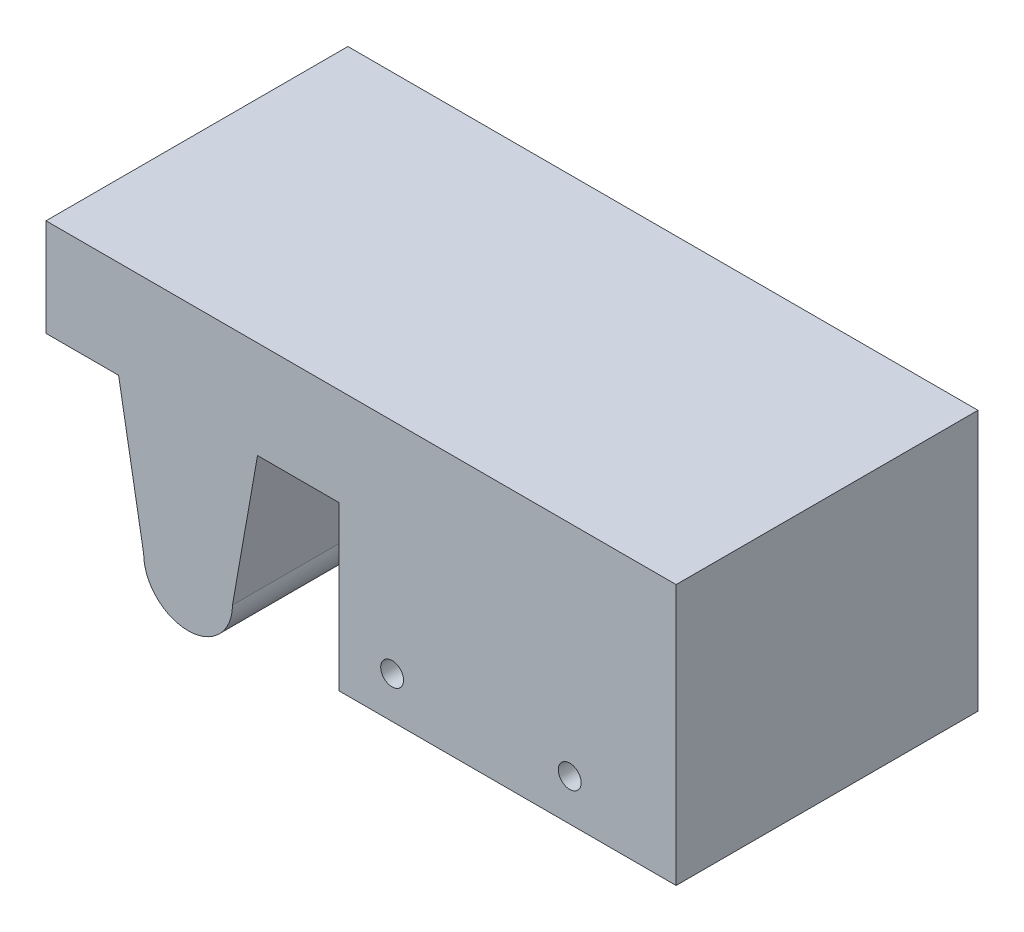
ISO-10303-21;
HEADER;
FILE_DESCRIPTION(('STEP AP214'),'2;1');
FILE_NAME('part.step','',(''),(''),'','','');
FILE_SCHEMA(('AUTOMOTIVE_DESIGN { 1 0 10303 214 1 1 1 1 }'));
ENDSEC;
DATA;
#1=APPLICATION_CONTEXT('core data for automotive mechanical design processes');
#2=APPLICATION_PROTOCOL_DEFINITION('international standard','automotive_design',2000,#1);
#3=PRODUCT_CONTEXT('',#1,'mechanical');
#4=PRODUCT('Part','Part','',(#3));
#5=PRODUCT_RELATED_PRODUCT_CATEGORY('part','',(#4));
#6=PRODUCT_DEFINITION_FORMATION('','',#4);
#7=PRODUCT_DEFINITION_CONTEXT('part definition',#1,'design');
#8=PRODUCT_DEFINITION('design','',#6,#7);
#9=PRODUCT_DEFINITION_SHAPE('','',#8);
#10=(LENGTH_UNIT() NAMED_UNIT(*) SI_UNIT(.MILLI.,.METRE.));
#11=(NAMED_UNIT(*) PLANE_ANGLE_UNIT() SI_UNIT($,.RADIAN.));
#12=(NAMED_UNIT(*) SI_UNIT($,.STERADIAN.) SOLID_ANGLE_UNIT());
#13=UNCERTAINTY_MEASURE_WITH_UNIT(LENGTH_MEASURE(1.E-05),#10,'distance_accuracy_value','');
#14=(GEOMETRIC_REPRESENTATION_CONTEXT(3) GLOBAL_UNCERTAINTY_ASSIGNED_CONTEXT((#13)) GLOBAL_UNIT_ASSIGNED_CONTEXT((#10,
#11,#12)) REPRESENTATION_CONTEXT('',''));
#15=CARTESIAN_POINT('',(0.,0.,0.));
#16=DIRECTION('',(0.,0.,1.));
#17=DIRECTION('',(1.,0.,0.));
#18=AXIS2_PLACEMENT_3D('',#15,#16,#17);
#19=CARTESIAN_POINT('',(48.,-5.616325,33.1917878));
#20=DIRECTION('',(0.,-1.,0.));
#21=DIRECTION('',(0.,0.,1.));
#22=AXIS2_PLACEMENT_3D('',#19,#20,#21);
#23=PLANE('',#22);
#24=DIRECTION('',(-1.,0.,0.));
#25=VECTOR('',#24,1.);
#26=CARTESIAN_POINT('',(12.2681524629967,-5.616325,55.1917878));
#27=LINE('',#26,#25);
#28=CARTESIAN_POINT('',(35.7318475370033,-5.616325,55.1917878));
#29=VERTEX_POINT('',#28);
#30=CARTESIAN_POINT('',(12.2681524629967,-5.616325,55.1917878));
#31=VERTEX_POINT('',#30);
#32=EDGE_CURVE('E154',#29,#31,#27,.T.);
#33=ORIENTED_EDGE('',*,*,#32,.T.);
#34=DIRECTION('',(0.,0.,-1.));
#35=VECTOR('',#34,1.);
#36=CARTESIAN_POINT('',(12.2681524629967,-5.616325,123.470216823141));
#37=LINE('',#36,#35);
#38=CARTESIAN_POINT('',(12.2681524629967,-5.616325,84.1917878));
#39=VERTEX_POINT('',#38);
#40=EDGE_CURVE('E150',#39,#31,#37,.T.);
#41=ORIENTED_EDGE('',*,*,#40,.F.);
#42=DIRECTION('',(1.,0.,0.));
#43=VECTOR('',#42,1.);
#44=CARTESIAN_POINT('',(-17.2191805697573,-5.616325,84.1917878));
#45=LINE('',#44,#43);
#46=CARTESIAN_POINT('',(0.,-5.616325,84.1917878));
#47=VERTEX_POINT('',#46);
#48=EDGE_CURVE('E189',#47,#39,#45,.T.);
#49=ORIENTED_EDGE('',*,*,#48,.F.);
#50=DIRECTION('',(0.,0.,1.));
#51=VECTOR('',#50,1.);
#52=CARTESIAN_POINT('',(0.,-5.616325,33.1917878));
#53=LINE('',#52,#51);
#54=CARTESIAN_POINT('',(0.,-5.616325,33.1917878));
#55=VERTEX_POINT('',#54);
#56=EDGE_CURVE('E56',#55,#47,#53,.T.);
#57=ORIENTED_EDGE('',*,*,#56,.F.);
#58=DIRECTION('',(-1.,0.,0.));
#59=VECTOR('',#58,1.);
#60=CARTESIAN_POINT('',(49.5,-5.616325,33.1917878));
#61=LINE('',#60,#59);
#62=CARTESIAN_POINT('',(49.5,-5.616325,33.1917878));
#63=VERTEX_POINT('',#62);
#64=EDGE_CURVE('E166',#63,#55,#61,.T.);
#65=ORIENTED_EDGE('',*,*,#64,.F.);
#66=DIRECTION('',(0.,0.,1.));
#67=VECTOR('',#66,1.);
#68=CARTESIAN_POINT('',(49.5,-5.616325,33.1917878));
#69=LINE('',#68,#67);
#70=CARTESIAN_POINT('',(49.5,-5.616325,84.1917878));
#71=VERTEX_POINT('',#70);
#72=EDGE_CURVE('E168',#63,#71,#69,.T.);
#73=ORIENTED_EDGE('',*,*,#72,.T.);
#74=CARTESIAN_POINT('',(35.7318475370033,-5.616325,84.1917878));
#75=VERTEX_POINT('',#74);
#76=EDGE_CURVE('E188',#75,#71,#45,.T.);
#77=ORIENTED_EDGE('',*,*,#76,.F.);
#78=DIRECTION('',(0.,0.,-1.));
#79=VECTOR('',#78,1.);
#80=CARTESIAN_POINT('',(35.7318475370033,-5.616325,123.470216823141));
#81=LINE('',#80,#79);
#82=EDGE_CURVE('E48',#75,#29,#81,.T.);
#83=ORIENTED_EDGE('',*,*,#82,.T.);
#84=EDGE_LOOP('',(#33,#41,#49,#57,#65,#73,#77,#83));
#85=FACE_BOUND('',#84,.T.);
#86=ADVANCED_FACE('F33',(#85),#23,.T.);
#87=CARTESIAN_POINT('',(0.,-8.166325,0.));
#88=DIRECTION('',(0.,1.,0.));
#89=DIRECTION('',(0.,0.,1.));
#90=AXIS2_PLACEMENT_3D('',#87,#88,#89);
#91=PLANE('',#90);
#92=DIRECTION('',(0.,0.,-1.));
#93=VECTOR('',#92,1.);
#94=CARTESIAN_POINT('',(49.5,-8.166325,-60.3469004731473));
#95=LINE('',#94,#93);
#96=CARTESIAN_POINT('',(49.5,-8.166325,76.1917878));
#97=VERTEX_POINT('',#96);
#98=CARTESIAN_POINT('',(49.5,-8.166325,33.1917878));
#99=VERTEX_POINT('',#98);
#100=EDGE_CURVE('E244',#97,#99,#95,.T.);
#101=ORIENTED_EDGE('',*,*,#100,.T.);
#102=DIRECTION('',(1.,0.,0.));
#103=VECTOR('',#102,1.);
#104=CARTESIAN_POINT('',(0.,-8.166325,33.1917878));
#105=LINE('',#104,#103);
#106=CARTESIAN_POINT('',(97.45,-8.166325,33.1917878));
#107=VERTEX_POINT('',#106);
#108=EDGE_CURVE('E185',#99,#107,#105,.T.);
#109=ORIENTED_EDGE('',*,*,#108,.T.);
#110=DIRECTION('',(0.,0.,-1.));
#111=VECTOR('',#110,1.);
#112=CARTESIAN_POINT('',(97.45,-8.166325,-9.80821219999999));
#113=LINE('',#112,#111);
#114=CARTESIAN_POINT('',(97.45,-8.166325,76.1917878));
#115=VERTEX_POINT('',#114);
#116=EDGE_CURVE('E231',#115,#107,#113,.T.);
#117=ORIENTED_EDGE('',*,*,#116,.F.);
#118=DIRECTION('',(-1.,0.,0.));
#119=VECTOR('',#118,1.);
#120=CARTESIAN_POINT('',(49.5,-8.166325,76.1917878));
#121=LINE('',#120,#119);
#122=EDGE_CURVE('E216',#115,#97,#121,.T.);
#123=ORIENTED_EDGE('',*,*,#122,.T.);
#124=EDGE_LOOP('',(#101,#109,#117,#123));
#125=FACE_BOUND('',#124,.T.);
#126=ADVANCED_FACE('F279',(#125),#91,.F.);
#127=CARTESIAN_POINT('',(0.,0.,10.));
#128=DIRECTION('',(1.,0.,0.));
#129=DIRECTION('',(0.,0.,-1.));
#130=AXIS2_PLACEMENT_3D('',#127,#128,#129);
#131=PLANE('',#130);
#132=DIRECTION('',(0.,1.,0.));
#133=VECTOR('',#132,1.);
#134=CARTESIAN_POINT('',(0.,10.8609375,33.1917878));
#135=LINE('',#134,#133);
#136=CARTESIAN_POINT('',(0.,10.8609375,33.1917878));
#137=VERTEX_POINT('',#136);
#138=EDGE_CURVE('E174',#55,#137,#135,.T.);
#139=ORIENTED_EDGE('',*,*,#138,.F.);
#140=ORIENTED_EDGE('',*,*,#56,.T.);
#141=DIRECTION('',(0.,1.,0.));
#142=VECTOR('',#141,1.);
#143=CARTESIAN_POINT('',(0.,10.8609375,84.1917878));
#144=LINE('',#143,#142);
#145=CARTESIAN_POINT('',(0.,10.8609375,84.1917878));
#146=VERTEX_POINT('',#145);
#147=EDGE_CURVE('E193',#47,#146,#144,.T.);
#148=ORIENTED_EDGE('',*,*,#147,.T.);
#149=DIRECTION('',(0.,0.,-1.));
#150=VECTOR('',#149,1.);
#151=CARTESIAN_POINT('',(0.,10.8609375,82.405200233796));
#152=LINE('',#151,#150);
#153=EDGE_CURVE('E241',#146,#137,#152,.T.);
#154=ORIENTED_EDGE('',*,*,#153,.T.);
#155=EDGE_LOOP('',(#139,#140,#148,#154));
#156=FACE_BOUND('',#155,.T.);
#157=ADVANCED_FACE('F35',(#156),#131,.F.);
#158=CARTESIAN_POINT('',(0.,10.8609375,82.405200233796));
#159=DIRECTION('',(0.,-1.,0.));
#160=DIRECTION('',(0.,0.,-1.));
#161=AXIS2_PLACEMENT_3D('',#158,#159,#160);
#162=PLANE('',#161);
#163=DIRECTION('',(0.,0.,1.));
#164=VECTOR('',#163,1.);
#165=CARTESIAN_POINT('',(106.45,10.8609375,33.1917878));
#166=LINE('',#165,#164);
#167=CARTESIAN_POINT('',(106.45,10.8609375,33.1917878));
#168=VERTEX_POINT('',#167);
#169=CARTESIAN_POINT('',(106.45,10.8609375,84.1917878));
#170=VERTEX_POINT('',#169);
#171=EDGE_CURVE('E237',#168,#170,#166,.T.);
#172=ORIENTED_EDGE('',*,*,#171,.F.);
#173=DIRECTION('',(-1.,0.,0.));
#174=VECTOR('',#173,1.);
#175=CARTESIAN_POINT('',(106.45,10.8609375,33.1917878));
#176=LINE('',#175,#174);
#177=EDGE_CURVE('E178',#168,#137,#176,.T.);
#178=ORIENTED_EDGE('',*,*,#177,.T.);
#179=ORIENTED_EDGE('',*,*,#153,.F.);
#180=DIRECTION('',(1.,0.,0.));
#181=VECTOR('',#180,1.);
#182=CARTESIAN_POINT('',(-17.2191805697573,10.8609375,84.1917878));
#183=LINE('',#182,#181);
#184=EDGE_CURVE('E202',#146,#170,#183,.T.);
#185=ORIENTED_EDGE('',*,*,#184,.T.);
#186=EDGE_LOOP('',(#172,#178,#179,#185));
#187=FACE_BOUND('',#186,.T.);
#188=ADVANCED_FACE('F263',(#187),#162,.F.);
#189=CARTESIAN_POINT('',(106.45,0.,0.));
#190=DIRECTION('',(-1.,0.,0.));
#191=DIRECTION('',(0.,0.,1.));
#192=AXIS2_PLACEMENT_3D('',#189,#190,#191);
#193=PLANE('',#192);
#194=DIRECTION('',(0.,0.,1.));
#195=VECTOR('',#194,1.);
#196=CARTESIAN_POINT('',(106.45,-33.166325,-17.8082122));
#197=LINE('',#196,#195);
#198=CARTESIAN_POINT('',(106.45,-33.166325,33.1917878));
#199=VERTEX_POINT('',#198);
#200=CARTESIAN_POINT('',(106.45,-33.166325,84.1917878));
#201=VERTEX_POINT('',#200);
#202=EDGE_CURVE('E232',#199,#201,#197,.T.);
#203=ORIENTED_EDGE('',*,*,#202,.F.);
#204=DIRECTION('',(0.,1.,0.));
#205=VECTOR('',#204,1.);
#206=CARTESIAN_POINT('',(106.45,10.8609375,33.1917878));
#207=LINE('',#206,#205);
#208=EDGE_CURVE('E175',#199,#168,#207,.T.);
#209=ORIENTED_EDGE('',*,*,#208,.T.);
#210=ORIENTED_EDGE('',*,*,#171,.T.);
#211=DIRECTION('',(0.,1.,0.));
#212=VECTOR('',#211,1.);
#213=CARTESIAN_POINT('',(106.45,-8.166325,84.1917878));
#214=LINE('',#213,#212);
#215=EDGE_CURVE('E205',#201,#170,#214,.T.);
#216=ORIENTED_EDGE('',*,*,#215,.F.);
#217=EDGE_LOOP('',(#203,#209,#210,#216));
#218=FACE_BOUND('',#217,.T.);
#219=ADVANCED_FACE('F255',(#218),#193,.F.);
#220=CARTESIAN_POINT('',(97.45,-33.166325,-9.80821219999999));
#221=DIRECTION('',(1.,0.,0.));
#222=DIRECTION('',(0.,0.,-1.));
#223=AXIS2_PLACEMENT_3D('',#220,#221,#222);
#224=PLANE('',#223);
#225=ORIENTED_EDGE('',*,*,#116,.T.);
#226=DIRECTION('',(0.,-1.,0.));
#227=VECTOR('',#226,1.);
#228=CARTESIAN_POINT('',(97.45,-33.166325,33.1917878));
#229=LINE('',#228,#227);
#230=CARTESIAN_POINT('',(97.45,-33.166325,33.1917878));
#231=VERTEX_POINT('',#230);
#232=EDGE_CURVE('E182',#107,#231,#229,.T.);
#233=ORIENTED_EDGE('',*,*,#232,.T.);
#234=DIRECTION('',(0.,0.,-1.));
#235=VECTOR('',#234,1.);
#236=CARTESIAN_POINT('',(97.45,-33.166325,-9.80821219999999));
#237=LINE('',#236,#235);
#238=CARTESIAN_POINT('',(97.45,-33.166325,76.1917878));
#239=VERTEX_POINT('',#238);
#240=EDGE_CURVE('E234',#239,#231,#237,.T.);
#241=ORIENTED_EDGE('',*,*,#240,.F.);
#242=DIRECTION('',(0.,1.,0.));
#243=VECTOR('',#242,1.);
#244=CARTESIAN_POINT('',(97.45,-33.166325,76.1917878));
#245=LINE('',#244,#243);
#246=EDGE_CURVE('E228',#239,#115,#245,.T.);
#247=ORIENTED_EDGE('',*,*,#246,.T.);
#248=EDGE_LOOP('',(#225,#233,#241,#247));
#249=FACE_BOUND('',#248,.T.);
#250=ADVANCED_FACE('F275',(#249),#224,.F.);
#251=CARTESIAN_POINT('',(0.,-33.166325,0.));
#252=DIRECTION('',(0.,1.,0.));
#253=DIRECTION('',(0.,0.,1.));
#254=AXIS2_PLACEMENT_3D('',#251,#252,#253);
#255=PLANE('',#254);
#256=ORIENTED_EDGE('',*,*,#240,.T.);
#257=DIRECTION('',(1.,0.,0.));
#258=VECTOR('',#257,1.);
#259=CARTESIAN_POINT('',(0.,-33.166325,33.1917878));
#260=LINE('',#259,#258);
#261=EDGE_CURVE('E41',#231,#199,#260,.T.);
#262=ORIENTED_EDGE('',*,*,#261,.T.);
#263=ORIENTED_EDGE('',*,*,#202,.T.);
#264=DIRECTION('',(1.,0.,0.));
#265=VECTOR('',#264,1.);
#266=CARTESIAN_POINT('',(49.5,-33.166325,84.1917878));
#267=LINE('',#266,#265);
#268=CARTESIAN_POINT('',(49.5,-33.166325,84.1917878));
#269=VERTEX_POINT('',#268);
#270=EDGE_CURVE('E208',#269,#201,#267,.T.);
#271=ORIENTED_EDGE('',*,*,#270,.F.);
#272=DIRECTION('',(0.,0.,1.));
#273=VECTOR('',#272,1.);
#274=CARTESIAN_POINT('',(49.5,-33.166325,84.1917878));
#275=LINE('',#274,#273);
#276=CARTESIAN_POINT('',(49.5,-33.166325,76.1917878));
#277=VERTEX_POINT('',#276);
#278=EDGE_CURVE('E214',#277,#269,#275,.T.);
#279=ORIENTED_EDGE('',*,*,#278,.F.);
#280=DIRECTION('',(-1.,0.,0.));
#281=VECTOR('',#280,1.);
#282=CARTESIAN_POINT('',(49.5,-33.166325,76.1917878));
#283=LINE('',#282,#281);
#284=EDGE_CURVE('E225',#239,#277,#283,.T.);
#285=ORIENTED_EDGE('',*,*,#284,.F.);
#286=EDGE_LOOP('',(#256,#262,#263,#271,#279,#285));
#287=FACE_BOUND('',#286,.T.);
#288=ADVANCED_FACE('F249',(#287),#255,.F.);
#289=CARTESIAN_POINT('',(88.475,-26.166325,84.1917878));
#290=DIRECTION('',(0.,0.,-1.));
#291=DIRECTION('',(1.,0.,0.));
#292=AXIS2_PLACEMENT_3D('',#289,#290,#291);
#293=CYLINDRICAL_SURFACE('',#292,1.9304);
#294=CARTESIAN_POINT('',(88.475,-26.166325,84.1917878));
#295=DIRECTION('',(0.,0.,1.));
#296=DIRECTION('',(1.,0.,0.));
#297=AXIS2_PLACEMENT_3D('',#294,#295,#296);
#298=CIRCLE('',#297,1.9304);
#299=CARTESIAN_POINT('',(90.4054,-26.166325,84.1917878));
#300=VERTEX_POINT('',#299);
#301=EDGE_CURVE('E199',#300,#300,#298,.T.);
#302=ORIENTED_EDGE('',*,*,#301,.T.);
#303=EDGE_LOOP('',(#302));
#304=FACE_BOUND('',#303,.T.);
#305=CARTESIAN_POINT('',(88.475,-26.166325,76.1917878));
#306=DIRECTION('',(0.,0.,1.));
#307=DIRECTION('',(1.,0.,0.));
#308=AXIS2_PLACEMENT_3D('',#305,#306,#307);
#309=CIRCLE('',#308,1.9304);
#310=CARTESIAN_POINT('',(90.4054,-26.166325,76.1917878));
#311=VERTEX_POINT('',#310);
#312=EDGE_CURVE('E222',#311,#311,#309,.T.);
#313=ORIENTED_EDGE('',*,*,#312,.F.);
#314=EDGE_LOOP('',(#313));
#315=FACE_BOUND('',#314,.T.);
#316=ADVANCED_FACE('F301',(#304,#315),#293,.F.);
#317=CARTESIAN_POINT('',(58.475,-26.166325,84.1917878));
#318=DIRECTION('',(0.,0.,-1.));
#319=DIRECTION('',(1.,0.,0.));
#320=AXIS2_PLACEMENT_3D('',#317,#318,#319);
#321=CYLINDRICAL_SURFACE('',#320,1.9304);
#322=CARTESIAN_POINT('',(58.475,-26.166325,84.1917878));
#323=DIRECTION('',(0.,0.,1.));
#324=DIRECTION('',(1.,0.,0.));
#325=AXIS2_PLACEMENT_3D('',#322,#323,#324);
#326=CIRCLE('',#325,1.9304);
#327=CARTESIAN_POINT('',(60.4054,-26.166325,84.1917878));
#328=VERTEX_POINT('',#327);
#329=EDGE_CURVE('E196',#328,#328,#326,.T.);
#330=ORIENTED_EDGE('',*,*,#329,.T.);
#331=EDGE_LOOP('',(#330));
#332=FACE_BOUND('',#331,.T.);
#333=CARTESIAN_POINT('',(58.475,-26.166325,76.1917878));
#334=DIRECTION('',(0.,0.,1.));
#335=DIRECTION('',(1.,0.,0.));
#336=AXIS2_PLACEMENT_3D('',#333,#334,#335);
#337=CIRCLE('',#336,1.9304);
#338=CARTESIAN_POINT('',(60.4054,-26.166325,76.1917878));
#339=VERTEX_POINT('',#338);
#340=EDGE_CURVE('E219',#339,#339,#337,.T.);
#341=ORIENTED_EDGE('',*,*,#340,.F.);
#342=EDGE_LOOP('',(#341));
#343=FACE_BOUND('',#342,.T.);
#344=ADVANCED_FACE('F306',(#332,#343),#321,.F.);
#345=CARTESIAN_POINT('',(49.5,-33.166325,76.1917878));
#346=DIRECTION('',(0.,0.,1.));
#347=DIRECTION('',(-1.,0.,0.));
#348=AXIS2_PLACEMENT_3D('',#345,#346,#347);
#349=PLANE('',#348);
#350=ORIENTED_EDGE('',*,*,#340,.T.);
#351=EDGE_LOOP('',(#350));
#352=FACE_BOUND('',#351,.T.);
#353=ORIENTED_EDGE('',*,*,#312,.T.);
#354=EDGE_LOOP('',(#353));
#355=FACE_BOUND('',#354,.T.);
#356=ORIENTED_EDGE('',*,*,#122,.F.);
#357=ORIENTED_EDGE('',*,*,#246,.F.);
#358=ORIENTED_EDGE('',*,*,#284,.T.);
#359=DIRECTION('',(0.,1.,0.));
#360=VECTOR('',#359,1.);
#361=CARTESIAN_POINT('',(49.5,-33.166325,76.1917878));
#362=LINE('',#361,#360);
#363=EDGE_CURVE('E211',#277,#97,#362,.T.);
#364=ORIENTED_EDGE('',*,*,#363,.T.);
#365=EDGE_LOOP('',(#356,#357,#358,#364));
#366=FACE_BOUND('',#365,.T.);
#367=ADVANCED_FACE('F273',(#352,#355,#366),#349,.F.);
#368=CARTESIAN_POINT('',(-17.2191805697573,10.8609375,84.1917878));
#369=DIRECTION('',(0.,0.,-1.));
#370=DIRECTION('',(0.,-1.,0.));
#371=AXIS2_PLACEMENT_3D('',#368,#369,#370);
#372=PLANE('',#371);
#373=ORIENTED_EDGE('',*,*,#329,.F.);
#374=EDGE_LOOP('',(#373));
#375=FACE_BOUND('',#374,.T.);
#376=ORIENTED_EDGE('',*,*,#301,.F.);
#377=EDGE_LOOP('',(#376));
#378=FACE_BOUND('',#377,.T.);
#379=ORIENTED_EDGE('',*,*,#48,.T.);
#380=DIRECTION('',(-0.173648177666935,0.984807753012207,0.));
#381=VECTOR('',#380,1.);
#382=CARTESIAN_POINT('',(16.5,-29.616325,84.1917878));
#383=LINE('',#382,#381);
#384=CARTESIAN_POINT('',(16.5,-29.616325,84.1917878));
#385=VERTEX_POINT('',#384);
#386=EDGE_CURVE('E163',#385,#39,#383,.T.);
#387=ORIENTED_EDGE('',*,*,#386,.F.);
#388=CARTESIAN_POINT('',(24.,-29.616325,84.1917878));
#389=DIRECTION('',(0.,0.,-1.));
#390=DIRECTION('',(0.,1.,0.));
#391=AXIS2_PLACEMENT_3D('',#388,#389,#390);
#392=CIRCLE('',#391,7.5);
#393=CARTESIAN_POINT('',(31.5,-29.616325,84.1917878));
#394=VERTEX_POINT('',#393);
#395=EDGE_CURVE('E148',#394,#385,#392,.T.);
#396=ORIENTED_EDGE('',*,*,#395,.F.);
#397=DIRECTION('',(-0.173648177666935,-0.984807753012207,0.));
#398=VECTOR('',#397,1.);
#399=CARTESIAN_POINT('',(31.5,-29.616325,84.1917878));
#400=LINE('',#399,#398);
#401=EDGE_CURVE('E165',#75,#394,#400,.T.);
#402=ORIENTED_EDGE('',*,*,#401,.F.);
#403=ORIENTED_EDGE('',*,*,#76,.T.);
#404=DIRECTION('',(0.,1.,0.));
#405=VECTOR('',#404,1.);
#406=CARTESIAN_POINT('',(49.5,-47.916325,84.1917878));
#407=LINE('',#406,#405);
#408=EDGE_CURVE('E169',#269,#71,#407,.T.);
#409=ORIENTED_EDGE('',*,*,#408,.F.);
#410=ORIENTED_EDGE('',*,*,#270,.T.);
#411=ORIENTED_EDGE('',*,*,#215,.T.);
#412=ORIENTED_EDGE('',*,*,#184,.F.);
#413=ORIENTED_EDGE('',*,*,#147,.F.);
#414=EDGE_LOOP('',(#379,#387,#396,#402,#403,#409,#410,#411,#412,#413));
#415=FACE_BOUND('',#414,.T.);
#416=ADVANCED_FACE('F259',(#375,#378,#415),#372,.F.);
#417=CARTESIAN_POINT('',(106.45,10.8609375,33.1917878));
#418=DIRECTION('',(0.,0.,1.));
#419=DIRECTION('',(1.,0.,0.));
#420=AXIS2_PLACEMENT_3D('',#417,#418,#419);
#421=PLANE('',#420);
#422=ORIENTED_EDGE('',*,*,#108,.F.);
#423=DIRECTION('',(0.,1.,0.));
#424=VECTOR('',#423,1.);
#425=CARTESIAN_POINT('',(49.5,10.8609375,33.1917878));
#426=LINE('',#425,#424);
#427=EDGE_CURVE('E11',#99,#63,#426,.T.);
#428=ORIENTED_EDGE('',*,*,#427,.T.);
#429=ORIENTED_EDGE('',*,*,#64,.T.);
#430=ORIENTED_EDGE('',*,*,#138,.T.);
#431=ORIENTED_EDGE('',*,*,#177,.F.);
#432=ORIENTED_EDGE('',*,*,#208,.F.);
#433=ORIENTED_EDGE('',*,*,#261,.F.);
#434=ORIENTED_EDGE('',*,*,#232,.F.);
#435=EDGE_LOOP('',(#422,#428,#429,#430,#431,#432,#433,#434));
#436=FACE_BOUND('',#435,.T.);
#437=ADVANCED_FACE('F277',(#436),#421,.F.);
#438=CARTESIAN_POINT('',(49.5,-47.916325,33.1917878));
#439=DIRECTION('',(1.,0.,0.));
#440=DIRECTION('',(0.,0.,-1.));
#441=AXIS2_PLACEMENT_3D('',#438,#439,#440);
#442=PLANE('',#441);
#443=ORIENTED_EDGE('',*,*,#363,.F.);
#444=ORIENTED_EDGE('',*,*,#278,.T.);
#445=ORIENTED_EDGE('',*,*,#408,.T.);
#446=ORIENTED_EDGE('',*,*,#72,.F.);
#447=ORIENTED_EDGE('',*,*,#427,.F.);
#448=ORIENTED_EDGE('',*,*,#100,.F.);
#449=EDGE_LOOP('',(#443,#444,#445,#446,#447,#448));
#450=FACE_BOUND('',#449,.T.);
#451=ADVANCED_FACE('F268',(#450),#442,.F.);
#452=CARTESIAN_POINT('',(24.,-29.616325,55.1917878));
#453=DIRECTION('',(0.,0.,1.));
#454=DIRECTION('',(1.,0.,0.));
#455=AXIS2_PLACEMENT_3D('',#452,#453,#454);
#456=PLANE('',#455);
#457=DIRECTION('',(0.173648177666935,0.984807753012207,0.));
#458=VECTOR('',#457,1.);
#459=CARTESIAN_POINT('',(31.5,-29.616325,55.1917878));
#460=LINE('',#459,#458);
#461=CARTESIAN_POINT('',(31.5,-29.616325,55.1917878));
#462=VERTEX_POINT('',#461);
#463=EDGE_CURVE('E137',#462,#29,#460,.T.);
#464=ORIENTED_EDGE('',*,*,#463,.F.);
#465=CARTESIAN_POINT('',(24.,-29.616325,55.1917878));
#466=DIRECTION('',(0.,0.,1.));
#467=DIRECTION('',(1.,0.,0.));
#468=AXIS2_PLACEMENT_3D('',#465,#466,#467);
#469=CIRCLE('',#468,7.5);
#470=CARTESIAN_POINT('',(16.5,-29.616325,55.1917878));
#471=VERTEX_POINT('',#470);
#472=EDGE_CURVE('E130',#462,#471,#469,.T.);
#473=ORIENTED_EDGE('',*,*,#472,.T.);
#474=DIRECTION('',(0.173648177666935,-0.984807753012207,0.));
#475=VECTOR('',#474,1.);
#476=CARTESIAN_POINT('',(16.5,-29.616325,55.1917878));
#477=LINE('',#476,#475);
#478=EDGE_CURVE('E135',#31,#471,#477,.T.);
#479=ORIENTED_EDGE('',*,*,#478,.F.);
#480=ORIENTED_EDGE('',*,*,#32,.F.);
#481=EDGE_LOOP('',(#464,#473,#479,#480));
#482=FACE_BOUND('',#481,.T.);
#483=ADVANCED_FACE('F132',(#482),#456,.F.);
#484=CARTESIAN_POINT('',(16.5,-29.616325,123.470216823141));
#485=DIRECTION('',(0.984807753012207,0.173648177666935,0.));
#486=DIRECTION('',(-0.173648177666935,0.984807753012207,0.));
#487=AXIS2_PLACEMENT_3D('',#484,#485,#486);
#488=PLANE('',#487);
#489=DIRECTION('',(0.,0.,-1.));
#490=VECTOR('',#489,1.);
#491=CARTESIAN_POINT('',(16.5,-29.616325,123.470216823141));
#492=LINE('',#491,#490);
#493=EDGE_CURVE('E145',#385,#471,#492,.T.);
#494=ORIENTED_EDGE('',*,*,#493,.F.);
#495=ORIENTED_EDGE('',*,*,#386,.T.);
#496=ORIENTED_EDGE('',*,*,#40,.T.);
#497=ORIENTED_EDGE('',*,*,#478,.T.);
#498=EDGE_LOOP('',(#494,#495,#496,#497));
#499=FACE_BOUND('',#498,.T.);
#500=ADVANCED_FACE('F152',(#499),#488,.F.);
#501=CARTESIAN_POINT('',(31.5,-29.616325,123.470216823141));
#502=DIRECTION('',(-0.984807753012207,0.173648177666935,0.));
#503=DIRECTION('',(-0.173648177666935,-0.984807753012207,0.));
#504=AXIS2_PLACEMENT_3D('',#501,#502,#503);
#505=PLANE('',#504);
#506=ORIENTED_EDGE('',*,*,#82,.F.);
#507=ORIENTED_EDGE('',*,*,#401,.T.);
#508=DIRECTION('',(0.,0.,-1.));
#509=VECTOR('',#508,1.);
#510=CARTESIAN_POINT('',(31.5,-29.616325,123.470216823141));
#511=LINE('',#510,#509);
#512=EDGE_CURVE('E161',#394,#462,#511,.T.);
#513=ORIENTED_EDGE('',*,*,#512,.T.);
#514=ORIENTED_EDGE('',*,*,#463,.T.);
#515=EDGE_LOOP('',(#506,#507,#513,#514));
#516=FACE_BOUND('',#515,.T.);
#517=ADVANCED_FACE('F324',(#516),#505,.F.);
#518=CARTESIAN_POINT('',(24.,-29.616325,123.470216823141));
#519=DIRECTION('',(0.,0.,-1.));
#520=DIRECTION('',(-1.,0.,0.));
#521=AXIS2_PLACEMENT_3D('',#518,#519,#520);
#522=CYLINDRICAL_SURFACE('',#521,7.5);
#523=ORIENTED_EDGE('',*,*,#512,.F.);
#524=ORIENTED_EDGE('',*,*,#395,.T.);
#525=ORIENTED_EDGE('',*,*,#493,.T.);
#526=ORIENTED_EDGE('',*,*,#472,.F.);
#527=EDGE_LOOP('',(#523,#524,#525,#526));
#528=FACE_BOUND('',#527,.T.);
#529=CARTESIAN_POINT('',(24.,-29.616325,10.1917878));
#530=DIRECTION('',(0.,0.,1.));
#531=DIRECTION('',(1.,0.,0.));
#532=AXIS2_PLACEMENT_3D('',#529,#530,#531);
#533=CIRCLE('',#532,7.5);
#534=CARTESIAN_POINT('',(31.5,-29.616325,10.1917878));
#535=VERTEX_POINT('',#534);
#536=EDGE_CURVE('E141',#535,#535,#533,.T.);
#537=ORIENTED_EDGE('',*,*,#536,.T.);
#538=EDGE_LOOP('',(#537));
#539=FACE_BOUND('',#538,.T.);
#540=ADVANCED_FACE('F146',(#528,#539),#522,.T.);
#541=CARTESIAN_POINT('',(24.,-29.616325,10.1917878));
#542=DIRECTION('',(0.,0.,1.));
#543=DIRECTION('',(1.,0.,0.));
#544=AXIS2_PLACEMENT_3D('',#541,#542,#543);
#545=PLANE('',#544);
#546=ORIENTED_EDGE('',*,*,#536,.F.);
#547=EDGE_LOOP('',(#546));
#548=FACE_BOUND('',#547,.T.);
#549=ADVANCED_FACE('F323',(#548),#545,.F.);
#550=CLOSED_SHELL('',(#86,#126,#157,#188,#219,#250,#288,#316,#344,#367,#416,#437,#451,#483,#500,
#517,#540,#549));
#551=MANIFOLD_SOLID_BREP('B2',#550);
#552=ADVANCED_BREP_SHAPE_REPRESENTATION('',(#18,#551),#14);
#553=SHAPE_DEFINITION_REPRESENTATION(#9,#552);
ENDSEC;
END-ISO-10303-21;
